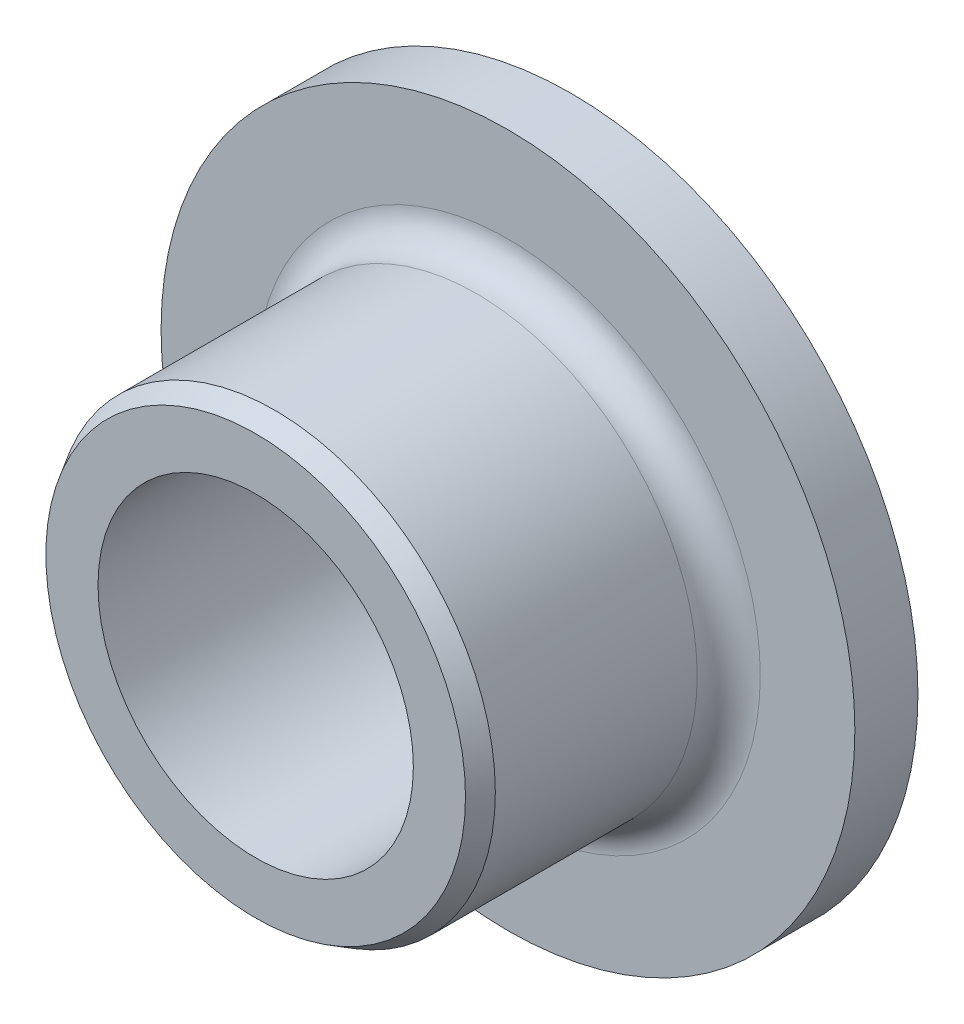
ISO-10303-21;
HEADER;
FILE_DESCRIPTION(('STEP AP214'),'2;1');
FILE_NAME('part.step','',(''),(''),'','','');
FILE_SCHEMA(('AUTOMOTIVE_DESIGN { 1 0 10303 214 1 1 1 1 }'));
ENDSEC;
DATA;
#1=APPLICATION_CONTEXT('core data for automotive mechanical design processes');
#2=APPLICATION_PROTOCOL_DEFINITION('international standard','automotive_design',2000,#1);
#3=PRODUCT_CONTEXT('',#1,'mechanical');
#4=PRODUCT('Part','Part','',(#3));
#5=PRODUCT_RELATED_PRODUCT_CATEGORY('part','',(#4));
#6=PRODUCT_DEFINITION_FORMATION('','',#4);
#7=PRODUCT_DEFINITION_CONTEXT('part definition',#1,'design');
#8=PRODUCT_DEFINITION('design','',#6,#7);
#9=PRODUCT_DEFINITION_SHAPE('','',#8);
#10=(LENGTH_UNIT() NAMED_UNIT(*) SI_UNIT(.MILLI.,.METRE.));
#11=(NAMED_UNIT(*) PLANE_ANGLE_UNIT() SI_UNIT($,.RADIAN.));
#12=(NAMED_UNIT(*) SI_UNIT($,.STERADIAN.) SOLID_ANGLE_UNIT());
#13=UNCERTAINTY_MEASURE_WITH_UNIT(LENGTH_MEASURE(1.E-05),#10,'distance_accuracy_value','');
#14=(GEOMETRIC_REPRESENTATION_CONTEXT(3) GLOBAL_UNCERTAINTY_ASSIGNED_CONTEXT((#13)) GLOBAL_UNIT_ASSIGNED_CONTEXT((#10,
#11,#12)) REPRESENTATION_CONTEXT('',''));
#15=CARTESIAN_POINT('',(0.,0.,0.));
#16=DIRECTION('',(0.,0.,1.));
#17=DIRECTION('',(1.,0.,0.));
#18=AXIS2_PLACEMENT_3D('',#15,#16,#17);
#19=CARTESIAN_POINT('',(0.,0.,5.));
#20=DIRECTION('',(0.,0.,-1.));
#21=DIRECTION('',(-1.,0.,0.));
#22=AXIS2_PLACEMENT_3D('',#19,#20,#21);
#23=CONICAL_SURFACE('',#22,3.32679491918952,0.523598775598298);
#24=CARTESIAN_POINT('',(0.,0.,4.70000000002307));
#25=DIRECTION('',(0.,0.,1.));
#26=DIRECTION('',(1.,0.,0.));
#27=AXIS2_PLACEMENT_3D('',#24,#25,#26);
#28=CIRCLE('',#27,3.49999999993309);
#29=CARTESIAN_POINT('',(3.49999999993309,0.,4.70000000002307));
#30=VERTEX_POINT('',#29);
#31=EDGE_CURVE('E60',#30,#30,#28,.T.);
#32=ORIENTED_EDGE('',*,*,#31,.T.);
#33=EDGE_LOOP('',(#32));
#34=FACE_BOUND('',#33,.T.);
#35=CARTESIAN_POINT('',(0.,0.,5.));
#36=DIRECTION('',(0.,0.,1.));
#37=DIRECTION('',(1.,0.,0.));
#38=AXIS2_PLACEMENT_3D('',#35,#36,#37);
#39=CIRCLE('',#38,3.32679491918952);
#40=CARTESIAN_POINT('',(3.32679491918952,0.,5.));
#41=VERTEX_POINT('',#40);
#42=EDGE_CURVE('E10',#41,#41,#39,.T.);
#43=ORIENTED_EDGE('',*,*,#42,.F.);
#44=EDGE_LOOP('',(#43));
#45=FACE_BOUND('',#44,.T.);
#46=ADVANCED_FACE('F32',(#34,#45),#23,.T.);
#47=CARTESIAN_POINT('',(2.5,0.,5.));
#48=DIRECTION('',(0.,0.,1.));
#49=DIRECTION('',(1.,0.,0.));
#50=AXIS2_PLACEMENT_3D('',#47,#48,#49);
#51=PLANE('',#50);
#52=ORIENTED_EDGE('',*,*,#42,.T.);
#53=EDGE_LOOP('',(#52));
#54=FACE_BOUND('',#53,.T.);
#55=CARTESIAN_POINT('',(0.,0.,5.));
#56=DIRECTION('',(0.,0.,1.));
#57=DIRECTION('',(1.,0.,0.));
#58=AXIS2_PLACEMENT_3D('',#55,#56,#57);
#59=CIRCLE('',#58,2.5);
#60=CARTESIAN_POINT('',(2.5,0.,5.));
#61=VERTEX_POINT('',#60);
#62=EDGE_CURVE('E38',#61,#61,#59,.T.);
#63=ORIENTED_EDGE('',*,*,#62,.F.);
#64=EDGE_LOOP('',(#63));
#65=FACE_BOUND('',#64,.T.);
#66=ADVANCED_FACE('F78',(#54,#65),#51,.T.);
#67=CARTESIAN_POINT('',(0.,0.,0.));
#68=DIRECTION('',(0.,0.,1.));
#69=DIRECTION('',(1.,0.,0.));
#70=AXIS2_PLACEMENT_3D('',#67,#68,#69);
#71=CYLINDRICAL_SURFACE('',#70,2.5);
#72=ORIENTED_EDGE('',*,*,#62,.T.);
#73=EDGE_LOOP('',(#72));
#74=FACE_BOUND('',#73,.T.);
#75=CARTESIAN_POINT('',(0.,0.,0.));
#76=DIRECTION('',(0.,0.,1.));
#77=DIRECTION('',(1.,0.,0.));
#78=AXIS2_PLACEMENT_3D('',#75,#76,#77);
#79=CIRCLE('',#78,2.5);
#80=CARTESIAN_POINT('',(2.5,0.,0.));
#81=VERTEX_POINT('',#80);
#82=EDGE_CURVE('E42',#81,#81,#79,.T.);
#83=ORIENTED_EDGE('',*,*,#82,.F.);
#84=EDGE_LOOP('',(#83));
#85=FACE_BOUND('',#84,.T.);
#86=ADVANCED_FACE('F82',(#74,#85),#71,.F.);
#87=CARTESIAN_POINT('',(5.49999999993309,0.,0.));
#88=DIRECTION('',(0.,0.,-1.));
#89=DIRECTION('',(-1.,0.,0.));
#90=AXIS2_PLACEMENT_3D('',#87,#88,#89);
#91=PLANE('',#90);
#92=ORIENTED_EDGE('',*,*,#82,.T.);
#93=EDGE_LOOP('',(#92));
#94=FACE_BOUND('',#93,.T.);
#95=CARTESIAN_POINT('',(0.,0.,0.));
#96=DIRECTION('',(0.,0.,1.));
#97=DIRECTION('',(1.,0.,0.));
#98=AXIS2_PLACEMENT_3D('',#95,#96,#97);
#99=CIRCLE('',#98,5.49999999993309);
#100=CARTESIAN_POINT('',(5.49999999993309,0.,0.));
#101=VERTEX_POINT('',#100);
#102=EDGE_CURVE('E46',#101,#101,#99,.T.);
#103=ORIENTED_EDGE('',*,*,#102,.F.);
#104=EDGE_LOOP('',(#103));
#105=FACE_BOUND('',#104,.T.);
#106=ADVANCED_FACE('F86',(#94,#105),#91,.T.);
#107=CARTESIAN_POINT('',(0.,0.,0.));
#108=DIRECTION('',(0.,0.,1.));
#109=DIRECTION('',(1.,0.,0.));
#110=AXIS2_PLACEMENT_3D('',#107,#108,#109);
#111=CYLINDRICAL_SURFACE('',#110,5.49999999993309);
#112=ORIENTED_EDGE('',*,*,#102,.T.);
#113=EDGE_LOOP('',(#112));
#114=FACE_BOUND('',#113,.T.);
#115=CARTESIAN_POINT('',(0.,0.,1.00000000000915));
#116=DIRECTION('',(0.,0.,1.));
#117=DIRECTION('',(1.,0.,0.));
#118=AXIS2_PLACEMENT_3D('',#115,#116,#117);
#119=CIRCLE('',#118,5.49999999993309);
#120=CARTESIAN_POINT('',(5.49999999993309,0.,1.00000000000915));
#121=VERTEX_POINT('',#120);
#122=EDGE_CURVE('E51',#121,#121,#119,.T.);
#123=ORIENTED_EDGE('',*,*,#122,.F.);
#124=EDGE_LOOP('',(#123));
#125=FACE_BOUND('',#124,.T.);
#126=ADVANCED_FACE('F92',(#114,#125),#111,.T.);
#127=CARTESIAN_POINT('',(3.99999999993309,0.,1.00000000000915));
#128=DIRECTION('',(0.,0.,1.));
#129=DIRECTION('',(1.,0.,0.));
#130=AXIS2_PLACEMENT_3D('',#127,#128,#129);
#131=PLANE('',#130);
#132=ORIENTED_EDGE('',*,*,#122,.T.);
#133=EDGE_LOOP('',(#132));
#134=FACE_BOUND('',#133,.T.);
#135=CARTESIAN_POINT('',(0.,0.,1.00000000000915));
#136=DIRECTION('',(0.,0.,1.));
#137=DIRECTION('',(1.,0.,0.));
#138=AXIS2_PLACEMENT_3D('',#135,#136,#137);
#139=CIRCLE('',#138,3.99999999993309);
#140=CARTESIAN_POINT('',(3.99999999993309,0.,1.00000000000915));
#141=VERTEX_POINT('',#140);
#142=EDGE_CURVE('E54',#141,#141,#139,.T.);
#143=ORIENTED_EDGE('',*,*,#142,.F.);
#144=EDGE_LOOP('',(#143));
#145=FACE_BOUND('',#144,.T.);
#146=ADVANCED_FACE('F74',(#134,#145),#131,.T.);
#147=CARTESIAN_POINT('',(0.,0.,1.50000000000915));
#148=DIRECTION('',(0.,0.,1.));
#149=DIRECTION('',(1.,0.,0.));
#150=AXIS2_PLACEMENT_3D('',#147,#148,#149);
#151=TOROIDAL_SURFACE('',#150,3.99999999993309,0.5);
#152=ORIENTED_EDGE('',*,*,#142,.T.);
#153=EDGE_LOOP('',(#152));
#154=FACE_BOUND('',#153,.T.);
#155=CARTESIAN_POINT('',(0.,0.,1.50000000000915));
#156=DIRECTION('',(0.,0.,1.));
#157=DIRECTION('',(1.,0.,0.));
#158=AXIS2_PLACEMENT_3D('',#155,#156,#157);
#159=CIRCLE('',#158,3.49999999993309);
#160=CARTESIAN_POINT('',(3.49999999993309,0.,1.50000000000915));
#161=VERTEX_POINT('',#160);
#162=EDGE_CURVE('E57',#161,#161,#159,.T.);
#163=ORIENTED_EDGE('',*,*,#162,.F.);
#164=EDGE_LOOP('',(#163));
#165=FACE_BOUND('',#164,.T.);
#166=ADVANCED_FACE('F68',(#154,#165),#151,.F.);
#167=CARTESIAN_POINT('',(0.,0.,0.));
#168=DIRECTION('',(0.,0.,1.));
#169=DIRECTION('',(1.,0.,0.));
#170=AXIS2_PLACEMENT_3D('',#167,#168,#169);
#171=CYLINDRICAL_SURFACE('',#170,3.49999999993309);
#172=ORIENTED_EDGE('',*,*,#162,.T.);
#173=EDGE_LOOP('',(#172));
#174=FACE_BOUND('',#173,.T.);
#175=ORIENTED_EDGE('',*,*,#31,.F.);
#176=EDGE_LOOP('',(#175));
#177=FACE_BOUND('',#176,.T.);
#178=ADVANCED_FACE('F66',(#174,#177),#171,.T.);
#179=CLOSED_SHELL('',(#46,#66,#86,#106,#126,#146,#166,#178));
#180=MANIFOLD_SOLID_BREP('B2',#179);
#181=ADVANCED_BREP_SHAPE_REPRESENTATION('',(#18,#180),#14);
#182=SHAPE_DEFINITION_REPRESENTATION(#9,#181);
ENDSEC;
END-ISO-10303-21;
